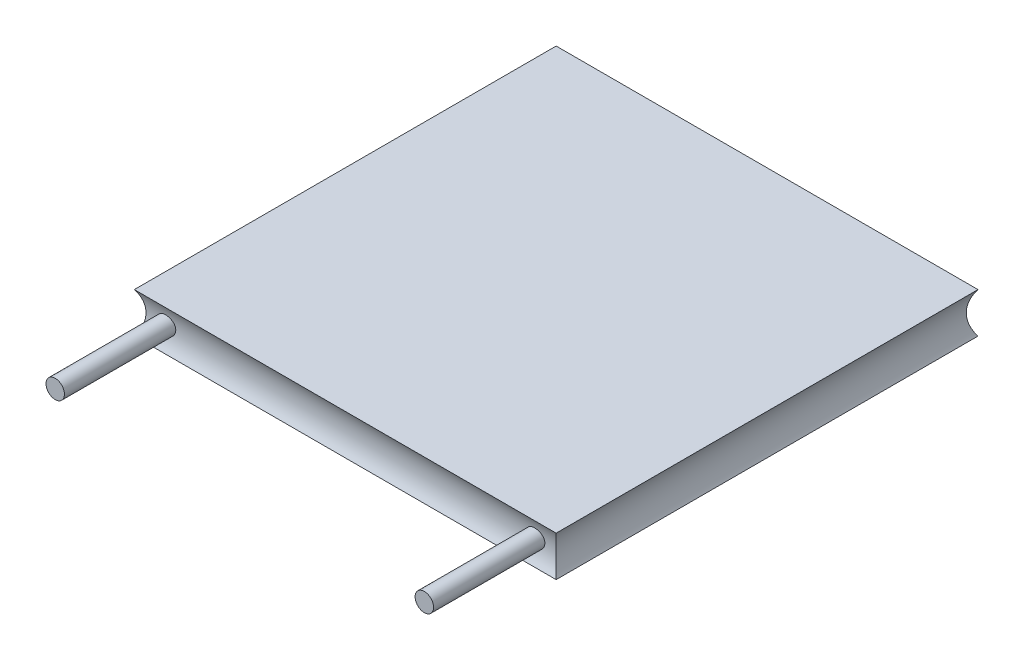
ISO-10303-21;
HEADER;
FILE_DESCRIPTION(('STEP AP214'),'2;1');
FILE_NAME('part.step','',(''),(''),'','','');
FILE_SCHEMA(('AUTOMOTIVE_DESIGN { 1 0 10303 214 1 1 1 1 }'));
ENDSEC;
DATA;
#1=APPLICATION_CONTEXT('core data for automotive mechanical design processes');
#2=APPLICATION_PROTOCOL_DEFINITION('international standard','automotive_design',2000,#1);
#3=PRODUCT_CONTEXT('',#1,'mechanical');
#4=PRODUCT('Part','Part','',(#3));
#5=PRODUCT_RELATED_PRODUCT_CATEGORY('part','',(#4));
#6=PRODUCT_DEFINITION_FORMATION('','',#4);
#7=PRODUCT_DEFINITION_CONTEXT('part definition',#1,'design');
#8=PRODUCT_DEFINITION('design','',#6,#7);
#9=PRODUCT_DEFINITION_SHAPE('','',#8);
#10=(LENGTH_UNIT() NAMED_UNIT(*) SI_UNIT(.MILLI.,.METRE.));
#11=(NAMED_UNIT(*) PLANE_ANGLE_UNIT() SI_UNIT($,.RADIAN.));
#12=(NAMED_UNIT(*) SI_UNIT($,.STERADIAN.) SOLID_ANGLE_UNIT());
#13=UNCERTAINTY_MEASURE_WITH_UNIT(LENGTH_MEASURE(1.E-05),#10,'distance_accuracy_value','');
#14=(GEOMETRIC_REPRESENTATION_CONTEXT(3) GLOBAL_UNCERTAINTY_ASSIGNED_CONTEXT((#13)) GLOBAL_UNIT_ASSIGNED_CONTEXT((#10,
#11,#12)) REPRESENTATION_CONTEXT('',''));
#15=CARTESIAN_POINT('',(0.,0.,0.));
#16=DIRECTION('',(0.,0.,1.));
#17=DIRECTION('',(1.,0.,0.));
#18=AXIS2_PLACEMENT_3D('',#15,#16,#17);
#19=CARTESIAN_POINT('',(43.,1.91,-40.));
#20=DIRECTION('',(0.,0.,1.));
#21=DIRECTION('',(1.,0.,0.));
#22=AXIS2_PLACEMENT_3D('',#19,#20,#21);
#23=CYLINDRICAL_SURFACE('',#22,3.55641673598582);
#24=CARTESIAN_POINT('',(43.,1.91,-43.));
#25=DIRECTION('',(0.707106781186547,0.,0.707106781186548));
#26=DIRECTION('',(-0.707106781186547,0.,0.707106781186548));
#27=AXIS2_PLACEMENT_3D('',#24,#25,#26);
#28=ELLIPSE('',#27,5.0295327814818,3.55641673598582);
#29=CARTESIAN_POINT('',(40.,3.82,-40.));
#30=VERTEX_POINT('',#29);
#31=CARTESIAN_POINT('',(40.,0.,-40.));
#32=VERTEX_POINT('',#31);
#33=EDGE_CURVE('E101',#30,#32,#28,.T.);
#34=ORIENTED_EDGE('',*,*,#33,.F.);
#35=DIRECTION('',(0.,0.,-1.));
#36=VECTOR('',#35,1.);
#37=CARTESIAN_POINT('',(40.,3.82,0.));
#38=LINE('',#37,#36);
#39=CARTESIAN_POINT('',(40.,3.82,0.));
#40=VERTEX_POINT('',#39);
#41=EDGE_CURVE('E92',#40,#30,#38,.T.);
#42=ORIENTED_EDGE('',*,*,#41,.F.);
#43=CARTESIAN_POINT('',(43.,1.91,3.));
#44=DIRECTION('',(-0.707106781186547,0.,0.707106781186548));
#45=DIRECTION('',(0.707106781186547,0.,0.707106781186548));
#46=AXIS2_PLACEMENT_3D('',#43,#44,#45);
#47=ELLIPSE('',#46,5.0295327814818,3.55641673598582);
#48=CARTESIAN_POINT('',(40.,0.,0.));
#49=VERTEX_POINT('',#48);
#50=EDGE_CURVE('E112',#40,#49,#47,.T.);
#51=ORIENTED_EDGE('',*,*,#50,.T.);
#52=DIRECTION('',(0.,0.,-1.));
#53=VECTOR('',#52,1.);
#54=CARTESIAN_POINT('',(40.,0.,0.));
#55=LINE('',#54,#53);
#56=EDGE_CURVE('E103',#49,#32,#55,.T.);
#57=ORIENTED_EDGE('',*,*,#56,.T.);
#58=EDGE_LOOP('',(#34,#42,#51,#57));
#59=FACE_BOUND('',#58,.T.);
#60=ADVANCED_FACE('F32',(#59),#23,.F.);
#61=CARTESIAN_POINT('',(-3.,1.91,-40.));
#62=DIRECTION('',(0.,0.,1.));
#63=DIRECTION('',(1.,0.,0.));
#64=AXIS2_PLACEMENT_3D('',#61,#62,#63);
#65=CYLINDRICAL_SURFACE('',#64,3.55641673598582);
#66=DIRECTION('',(0.,0.,1.));
#67=VECTOR('',#66,1.);
#68=CARTESIAN_POINT('',(0.,3.82,0.));
#69=LINE('',#68,#67);
#70=CARTESIAN_POINT('',(0.,3.82,-40.));
#71=VERTEX_POINT('',#70);
#72=CARTESIAN_POINT('',(0.,3.82,0.));
#73=VERTEX_POINT('',#72);
#74=EDGE_CURVE('E85',#71,#73,#69,.T.);
#75=ORIENTED_EDGE('',*,*,#74,.F.);
#76=CARTESIAN_POINT('',(-2.99999999999999,1.91,-43.));
#77=DIRECTION('',(-0.707106781186547,0.,0.707106781186548));
#78=DIRECTION('',(0.707106781186547,0.,0.707106781186548));
#79=AXIS2_PLACEMENT_3D('',#76,#77,#78);
#80=ELLIPSE('',#79,5.0295327814818,3.55641673598582);
#81=CARTESIAN_POINT('',(0.,0.,-40.));
#82=VERTEX_POINT('',#81);
#83=EDGE_CURVE('E11',#71,#82,#80,.F.);
#84=ORIENTED_EDGE('',*,*,#83,.T.);
#85=DIRECTION('',(0.,0.,1.));
#86=VECTOR('',#85,1.);
#87=CARTESIAN_POINT('',(0.,0.,0.));
#88=LINE('',#87,#86);
#89=CARTESIAN_POINT('',(0.,0.,0.));
#90=VERTEX_POINT('',#89);
#91=EDGE_CURVE('E98',#82,#90,#88,.T.);
#92=ORIENTED_EDGE('',*,*,#91,.T.);
#93=CARTESIAN_POINT('',(-2.99999999999999,1.91,3.));
#94=DIRECTION('',(0.707106781186547,0.,0.707106781186548));
#95=DIRECTION('',(-0.707106781186547,0.,0.707106781186548));
#96=AXIS2_PLACEMENT_3D('',#93,#94,#95);
#97=ELLIPSE('',#96,5.02953278148179,3.55641673598582);
#98=EDGE_CURVE('E46',#73,#90,#97,.F.);
#99=ORIENTED_EDGE('',*,*,#98,.F.);
#100=EDGE_LOOP('',(#75,#84,#92,#99));
#101=FACE_BOUND('',#100,.T.);
#102=ADVANCED_FACE('F86',(#101),#65,.F.);
#103=CARTESIAN_POINT('',(0.,3.82,0.));
#104=DIRECTION('',(0.,-1.,0.));
#105=DIRECTION('',(0.,0.,-1.));
#106=AXIS2_PLACEMENT_3D('',#103,#104,#105);
#107=PLANE('',#106);
#108=ORIENTED_EDGE('',*,*,#74,.T.);
#109=DIRECTION('',(1.,0.,0.));
#110=VECTOR('',#109,1.);
#111=CARTESIAN_POINT('',(0.,3.82,0.));
#112=LINE('',#111,#110);
#113=EDGE_CURVE('E61',#73,#40,#112,.T.);
#114=ORIENTED_EDGE('',*,*,#113,.T.);
#115=ORIENTED_EDGE('',*,*,#41,.T.);
#116=DIRECTION('',(-1.,0.,0.));
#117=VECTOR('',#116,1.);
#118=CARTESIAN_POINT('',(0.,3.82,-40.));
#119=LINE('',#118,#117);
#120=EDGE_CURVE('E79',#30,#71,#119,.T.);
#121=ORIENTED_EDGE('',*,*,#120,.T.);
#122=EDGE_LOOP('',(#108,#114,#115,#121));
#123=FACE_BOUND('',#122,.T.);
#124=ADVANCED_FACE('F90',(#123),#107,.F.);
#125=CARTESIAN_POINT('',(0.,0.,0.));
#126=DIRECTION('',(0.,-1.,0.));
#127=DIRECTION('',(0.,0.,-1.));
#128=AXIS2_PLACEMENT_3D('',#125,#126,#127);
#129=PLANE('',#128);
#130=ORIENTED_EDGE('',*,*,#91,.F.);
#131=DIRECTION('',(-1.,0.,0.));
#132=VECTOR('',#131,1.);
#133=CARTESIAN_POINT('',(0.,0.,-40.));
#134=LINE('',#133,#132);
#135=EDGE_CURVE('E54',#32,#82,#134,.T.);
#136=ORIENTED_EDGE('',*,*,#135,.F.);
#137=ORIENTED_EDGE('',*,*,#56,.F.);
#138=DIRECTION('',(1.,0.,0.));
#139=VECTOR('',#138,1.);
#140=CARTESIAN_POINT('',(0.,0.,0.));
#141=LINE('',#140,#139);
#142=EDGE_CURVE('E100',#90,#49,#141,.T.);
#143=ORIENTED_EDGE('',*,*,#142,.F.);
#144=EDGE_LOOP('',(#130,#136,#137,#143));
#145=FACE_BOUND('',#144,.T.);
#146=ADVANCED_FACE('F34',(#145),#129,.T.);
#147=CARTESIAN_POINT('',(45.,1.91,3.));
#148=DIRECTION('',(-1.,0.,0.));
#149=DIRECTION('',(0.,0.,1.));
#150=AXIS2_PLACEMENT_3D('',#147,#148,#149);
#151=CYLINDRICAL_SURFACE('',#150,3.55641673598582);
#152=CARTESIAN_POINT('',(38.375,1.91,-0.556416735985814));
#153=CARTESIAN_POINT('',(38.374998598679,1.8616308459115,-0.556415902527128));
#154=CARTESIAN_POINT('',(38.3709757996563,1.81324587995912,-0.555420108855625));
#155=CARTESIAN_POINT('',(38.3550139973309,1.71786101958329,-0.551544136294851));
#156=CARTESIAN_POINT('',(38.3430703514392,1.67086195435182,-0.548662852289799));
#157=CARTESIAN_POINT('',(38.3116720050362,1.57964025191008,-0.541335191646021));
#158=CARTESIAN_POINT('',(38.2922261698422,1.53541440903252,-0.536890662835052));
#159=CARTESIAN_POINT('',(38.2464062339312,1.45085282436528,-0.5269106986228));
#160=CARTESIAN_POINT('',(38.2200319531521,1.4105171837146,-0.521375234870345));
#161=CARTESIAN_POINT('',(38.1605466618434,1.33407432400642,-0.509691335434536));
#162=CARTESIAN_POINT('',(38.1273232547772,1.29805597204518,-0.503533682584858));
#163=CARTESIAN_POINT('',(38.0553235301818,1.23204225568536,-0.491361128569465));
#164=CARTESIAN_POINT('',(38.0165466054352,1.20204755077042,-0.485346243097772));
#165=CARTESIAN_POINT('',(37.9338549707972,1.14851809653142,-0.474047617559852));
#166=CARTESIAN_POINT('',(37.8898745795205,1.12508211360706,-0.468775594383573));
#167=CARTESIAN_POINT('',(37.7984477655658,1.08597029571158,-0.459693764252192));
#168=CARTESIAN_POINT('',(37.7510018791969,1.07029326289749,-0.455883731612347));
#169=CARTESIAN_POINT('',(37.6549663807905,1.04744626522004,-0.450251894432766));
#170=CARTESIAN_POINT('',(37.6064169391631,1.04011683182947,-0.448392874946176));
#171=CARTESIAN_POINT('',(37.5087446926879,1.03367647971918,-0.446762106119825));
#172=CARTESIAN_POINT('',(37.4596219792193,1.03456426857747,-0.446990028541391));
#173=CARTESIAN_POINT('',(37.3634147829779,1.04440578109864,-0.44947390609781));
#174=CARTESIAN_POINT('',(37.3163095078391,1.05317013321315,-0.451682244618913));
#175=CARTESIAN_POINT('',(37.2242592826337,1.07821417226658,-0.457802326656352));
#176=CARTESIAN_POINT('',(37.1793144823828,1.09449437955591,-0.461714188112809));
#177=CARTESIAN_POINT('',(37.0923499646283,1.13427102196733,-0.470844679217189));
#178=CARTESIAN_POINT('',(37.0503632921939,1.15783672627569,-0.476075759777016));
#179=CARTESIAN_POINT('',(36.9708721025532,1.21146694168881,-0.487248170095442));
#180=CARTESIAN_POINT('',(36.9333683485551,1.24153255695092,-0.493189620449726));
#181=CARTESIAN_POINT('',(36.8628216672831,1.30829294959149,-0.505314324464301));
#182=CARTESIAN_POINT('',(36.8299303148508,1.34514770318591,-0.511499727423643));
#183=CARTESIAN_POINT('',(36.7707666845995,1.42392360624861,-0.523267424917355));
#184=CARTESIAN_POINT('',(36.7444945966379,1.4658449009872,-0.528849702149916));
#185=CARTESIAN_POINT('',(36.6992620859443,1.55377596469481,-0.538808555390594));
#186=CARTESIAN_POINT('',(36.6803256444725,1.59979854824151,-0.543181163725099));
#187=CARTESIAN_POINT('',(36.6504998890942,1.6945051506441,-0.55019908835339));
#188=CARTESIAN_POINT('',(36.6396090857058,1.74318867508915,-0.552844724349472));
#189=CARTESIAN_POINT('',(36.6264137616661,1.8405387173423,-0.556063542336874));
#190=CARTESIAN_POINT('',(36.6239027451586,1.88917563876097,-0.556686555374659));
#191=CARTESIAN_POINT('',(36.6269728024684,1.98617461128272,-0.555931552601305));
#192=CARTESIAN_POINT('',(36.6325531722607,2.03453668593246,-0.554553710882928));
#193=CARTESIAN_POINT('',(36.6514772258248,2.12890004023056,-0.549983685565589));
#194=CARTESIAN_POINT('',(36.6647088365018,2.17492517938725,-0.54681770929121));
#195=CARTESIAN_POINT('',(36.6984322475748,2.26410057895302,-0.539027837376695));
#196=CARTESIAN_POINT('',(36.7189247675669,2.30725055391378,-0.534403797239417));
#197=CARTESIAN_POINT('',(36.7669924644276,2.39027668411087,-0.524090838643032));
#198=CARTESIAN_POINT('',(36.7946840572096,2.43008327358292,-0.518384878998332));
#199=CARTESIAN_POINT('',(36.8562144499483,2.50455799707723,-0.506568846043651));
#200=CARTESIAN_POINT('',(36.8900542755864,2.53922527197625,-0.500458705414328));
#201=CARTESIAN_POINT('',(36.9638779977032,2.60328372723844,-0.488344528011203));
#202=CARTESIAN_POINT('',(37.0039885765891,2.63253027693132,-0.482346444479975));
#203=CARTESIAN_POINT('',(37.0886707452974,2.68387638366637,-0.471297715768934));
#204=CARTESIAN_POINT('',(37.1332421358646,2.70597625974918,-0.466247028299848));
#205=CARTESIAN_POINT('',(37.2253396874762,2.74223835079458,-0.45771983805811));
#206=CARTESIAN_POINT('',(37.2728464308914,2.75644758170368,-0.454234035393266));
#207=CARTESIAN_POINT('',(37.3696729339036,2.77665124671594,-0.449221071542242));
#208=CARTESIAN_POINT('',(37.4189923095747,2.78264741021523,-0.447693498023127));
#209=CARTESIAN_POINT('',(37.516574250706,2.78616652903147,-0.446800670529186));
#210=CARTESIAN_POINT('',(37.5648280858243,2.78392037493124,-0.447376492432506));
#211=CARTESIAN_POINT('',(37.6602463612992,2.77154541074651,-0.450489736677328));
#212=CARTESIAN_POINT('',(37.7074108222128,2.76141674953446,-0.453027121971889));
#213=CARTESIAN_POINT('',(37.799069522786,2.73368853807055,-0.4597452817604));
#214=CARTESIAN_POINT('',(37.8435771970966,2.7161310025936,-0.463916804526822));
#215=CARTESIAN_POINT('',(37.929046319961,2.67407691392435,-0.473434786722396));
#216=CARTESIAN_POINT('',(37.970007291187,2.64957942861861,-0.478781403958331));
#217=CARTESIAN_POINT('',(38.0483390704684,2.59361139904167,-0.490216247316178));
#218=CARTESIAN_POINT('',(38.0855927647285,2.56198005222503,-0.496319819146108));
#219=CARTESIAN_POINT('',(38.1543386073036,2.49295727121688,-0.508487801772201));
#220=CARTESIAN_POINT('',(38.1858293918904,2.45556447748931,-0.514552202972385));
#221=CARTESIAN_POINT('',(38.2426882703491,2.37529555496477,-0.526084303366374));
#222=CARTESIAN_POINT('',(38.2679403830674,2.33233538806343,-0.531539793713082));
#223=CARTESIAN_POINT('',(38.3108240229416,2.24265001238727,-0.541111551898993));
#224=CARTESIAN_POINT('',(38.3284611383486,2.19592759451138,-0.545228801253424));
#225=CARTESIAN_POINT('',(38.3529246148235,2.10939136916296,-0.551034340816316));
#226=CARTESIAN_POINT('',(38.3611852834943,2.06999803572006,-0.553039062397555));
#227=CARTESIAN_POINT('',(38.3722233654528,1.99040673917247,-0.555730559996669));
#228=CARTESIAN_POINT('',(38.3750011649052,1.95020883293622,-0.556417428832355));
#229=CARTESIAN_POINT('',(38.375,1.91,-0.556416735985814));
#230=B_SPLINE_CURVE_WITH_KNOTS('',3,(#152,#153,#154,#155,#156,#157,#158,#159,#160,#161,#162,
#163,#164,#165,#166,#167,#168,#169,#170,#171,#172,#173,#174,#175,#176,#177,#178,#179,#180,#181,
#182,#183,#184,#185,#186,#187,#188,#189,#190,#191,#192,#193,#194,#195,#196,#197,#198,#199,#200,
#201,#202,#203,#204,#205,#206,#207,#208,#209,#210,#211,#212,#213,#214,#215,#216,#217,#218,#219,
#220,#221,#222,#223,#224,#225,#226,#227,#228,#229),.UNSPECIFIED.,.T.,.F.,(4,2,2,2,2,2,2,2,2,2,2,
2,2,2,2,2,2,2,2,2,2,2,2,2,2,2,2,2,2,2,2,2,2,2,2,2,2,2,4),(0.,0.144960135121688,
0.290005309867597,0.43487960752676,0.579757670669876,0.727235546809821,0.874729560396967,
1.02433788571062,1.17392310696737,1.32060009433878,1.4672540124372,1.6104736501978,
1.75370320507036,1.89833877092233,2.04299892573905,2.19164920131279,2.34030374007066,
2.48944023089122,2.63854910528175,2.78395536629735,2.92934897638913,3.07266498879996,
3.21599520858988,3.36180547196139,3.50764008256232,3.65693339635088,3.80622004449124,
3.95460736166616,4.10296342865066,4.24719575340382,4.39142535418905,4.53484992855497,
4.67829377559708,4.82536837197727,4.97247772704175,5.12214499518537,5.27170224283497,
5.39221475808379,5.5127187851928),.UNSPECIFIED.);
#231=CARTESIAN_POINT('',(38.375,1.91,-0.556416735985814));
#232=VERTEX_POINT('',#231);
#233=EDGE_CURVE('E36',#232,#232,#230,.T.);
#234=ORIENTED_EDGE('',*,*,#233,.T.);
#235=EDGE_LOOP('',(#234));
#236=FACE_BOUND('',#235,.T.);
#237=CARTESIAN_POINT('',(3.375,1.91,-0.556416735985814));
#238=CARTESIAN_POINT('',(3.37499859867904,1.8616308459115,-0.556415902527128));
#239=CARTESIAN_POINT('',(3.37097579965628,1.81324587995912,-0.555420108855626));
#240=CARTESIAN_POINT('',(3.35501399733093,1.71786101958329,-0.551544136294851));
#241=CARTESIAN_POINT('',(3.34307035143919,1.67086195435182,-0.548662852289799));
#242=CARTESIAN_POINT('',(3.31167200503617,1.57964025191008,-0.541335191646021));
#243=CARTESIAN_POINT('',(3.29222616984221,1.53541440903252,-0.536890662835052));
#244=CARTESIAN_POINT('',(3.24640623393124,1.45085282436528,-0.5269106986228));
#245=CARTESIAN_POINT('',(3.22003195315212,1.4105171837146,-0.521375234870345));
#246=CARTESIAN_POINT('',(3.16054666184342,1.33407432400642,-0.509691335434536));
#247=CARTESIAN_POINT('',(3.12732325477717,1.29805597204518,-0.503533682584858));
#248=CARTESIAN_POINT('',(3.05532353018179,1.23204225568536,-0.491361128569464));
#249=CARTESIAN_POINT('',(3.01654660543525,1.20204755077042,-0.485346243097772));
#250=CARTESIAN_POINT('',(2.93385497079722,1.14851809653142,-0.474047617559852));
#251=CARTESIAN_POINT('',(2.88987457952052,1.12508211360705,-0.468775594383572));
#252=CARTESIAN_POINT('',(2.7984477655658,1.08597029571158,-0.459693764252191));
#253=CARTESIAN_POINT('',(2.75100187919687,1.07029326289749,-0.455883731612346));
#254=CARTESIAN_POINT('',(2.6549663807905,1.04744626522004,-0.450251894432765));
#255=CARTESIAN_POINT('',(2.60641693916312,1.04011683182946,-0.448392874946176));
#256=CARTESIAN_POINT('',(2.50874469268794,1.03367647971917,-0.446762106119824));
#257=CARTESIAN_POINT('',(2.45962197921934,1.03456426857746,-0.44699002854139));
#258=CARTESIAN_POINT('',(2.36341478297788,1.04440578109864,-0.449473906097809));
#259=CARTESIAN_POINT('',(2.31630950783909,1.05317013321315,-0.451682244618913));
#260=CARTESIAN_POINT('',(2.22425928263374,1.07821417226658,-0.457802326656351));
#261=CARTESIAN_POINT('',(2.17931448238275,1.09449437955591,-0.461714188112809));
#262=CARTESIAN_POINT('',(2.09234996462831,1.13427102196734,-0.47084467921719));
#263=CARTESIAN_POINT('',(2.05036329219392,1.15783672627569,-0.476075759777017));
#264=CARTESIAN_POINT('',(1.97087210255316,1.21146694168882,-0.487248170095443));
#265=CARTESIAN_POINT('',(1.93336834855515,1.24153255695092,-0.493189620449726));
#266=CARTESIAN_POINT('',(1.86282166728311,1.30829294959148,-0.5053143244643));
#267=CARTESIAN_POINT('',(1.8299303148508,1.34514770318591,-0.511499727423642));
#268=CARTESIAN_POINT('',(1.77076668459947,1.4239236062486,-0.523267424917354));
#269=CARTESIAN_POINT('',(1.74449459663786,1.46584490098719,-0.528849702149916));
#270=CARTESIAN_POINT('',(1.69926208594429,1.55377596469481,-0.538808555390594));
#271=CARTESIAN_POINT('',(1.68032564447252,1.59979854824151,-0.543181163725099));
#272=CARTESIAN_POINT('',(1.6504998890942,1.6945051506441,-0.550199088353389));
#273=CARTESIAN_POINT('',(1.6396090857058,1.74318867508915,-0.552844724349472));
#274=CARTESIAN_POINT('',(1.6264137616661,1.8405387173423,-0.556063542336874));
#275=CARTESIAN_POINT('',(1.62390274515859,1.88917563876097,-0.556686555374659));
#276=CARTESIAN_POINT('',(1.62697280246843,1.98617461128273,-0.555931552601305));
#277=CARTESIAN_POINT('',(1.63255317226071,2.03453668593246,-0.554553710882929));
#278=CARTESIAN_POINT('',(1.65147722582484,2.12890004023056,-0.549983685565589));
#279=CARTESIAN_POINT('',(1.66470883650181,2.17492517938725,-0.54681770929121));
#280=CARTESIAN_POINT('',(1.69843224757483,2.26410057895302,-0.539027837376695));
#281=CARTESIAN_POINT('',(1.7189247675669,2.30725055391378,-0.534403797239417));
#282=CARTESIAN_POINT('',(1.7669924644276,2.39027668411087,-0.524090838643032));
#283=CARTESIAN_POINT('',(1.79468405720963,2.43008327358292,-0.518384878998332));
#284=CARTESIAN_POINT('',(1.85621444994828,2.50455799707723,-0.50656884604365));
#285=CARTESIAN_POINT('',(1.89005427558637,2.53922527197625,-0.500458705414327));
#286=CARTESIAN_POINT('',(1.96387799770317,2.60328372723844,-0.488344528011202));
#287=CARTESIAN_POINT('',(2.00398857658905,2.63253027693132,-0.482346444479974));
#288=CARTESIAN_POINT('',(2.08867074529738,2.68387638366637,-0.471297715768933));
#289=CARTESIAN_POINT('',(2.13324213586464,2.70597625974918,-0.466247028299848));
#290=CARTESIAN_POINT('',(2.22533968747624,2.74223835079458,-0.45771983805811));
#291=CARTESIAN_POINT('',(2.27284643089141,2.75644758170368,-0.454234035393265));
#292=CARTESIAN_POINT('',(2.36967293390364,2.77665124671595,-0.449221071542242));
#293=CARTESIAN_POINT('',(2.41899230957466,2.78264741021523,-0.447693498023127));
#294=CARTESIAN_POINT('',(2.51657425070601,2.78616652903147,-0.446800670529185));
#295=CARTESIAN_POINT('',(2.56482808582434,2.78392037493124,-0.447376492432505));
#296=CARTESIAN_POINT('',(2.66024636129921,2.77154541074651,-0.450489736677327));
#297=CARTESIAN_POINT('',(2.70741082221282,2.76141674953446,-0.453027121971889));
#298=CARTESIAN_POINT('',(2.79906952278598,2.73368853807055,-0.459745281760399));
#299=CARTESIAN_POINT('',(2.84357719709662,2.71613100259361,-0.463916804526821));
#300=CARTESIAN_POINT('',(2.92904631996101,2.67407691392435,-0.473434786722396));
#301=CARTESIAN_POINT('',(2.97000729118703,2.64957942861861,-0.478781403958331));
#302=CARTESIAN_POINT('',(3.04833907046838,2.59361139904167,-0.490216247316178));
#303=CARTESIAN_POINT('',(3.0855927647285,2.56198005222503,-0.496319819146109));
#304=CARTESIAN_POINT('',(3.15433860730363,2.49295727121688,-0.508487801772201));
#305=CARTESIAN_POINT('',(3.18582939189037,2.45556447748931,-0.514552202972385));
#306=CARTESIAN_POINT('',(3.24268827034906,2.37529555496477,-0.526084303366373));
#307=CARTESIAN_POINT('',(3.26794038306745,2.33233538806343,-0.531539793713081));
#308=CARTESIAN_POINT('',(3.31082402294163,2.24265001238727,-0.541111551898992));
#309=CARTESIAN_POINT('',(3.32846113834865,2.19592759451138,-0.545228801253424));
#310=CARTESIAN_POINT('',(3.35292461482352,2.10939136916296,-0.551034340816316));
#311=CARTESIAN_POINT('',(3.36118528349434,2.06999803572007,-0.553039062397554));
#312=CARTESIAN_POINT('',(3.37222336545276,1.99040673917247,-0.555730559996669));
#313=CARTESIAN_POINT('',(3.37500116490523,1.95020883293622,-0.556417428832355));
#314=CARTESIAN_POINT('',(3.375,1.91,-0.556416735985814));
#315=B_SPLINE_CURVE_WITH_KNOTS('',3,(#237,#238,#239,#240,#241,#242,#243,#244,#245,#246,#247,
#248,#249,#250,#251,#252,#253,#254,#255,#256,#257,#258,#259,#260,#261,#262,#263,#264,#265,#266,
#267,#268,#269,#270,#271,#272,#273,#274,#275,#276,#277,#278,#279,#280,#281,#282,#283,#284,#285,
#286,#287,#288,#289,#290,#291,#292,#293,#294,#295,#296,#297,#298,#299,#300,#301,#302,#303,#304,
#305,#306,#307,#308,#309,#310,#311,#312,#313,#314),.UNSPECIFIED.,.T.,.F.,(4,2,2,2,2,2,2,2,2,2,2,
2,2,2,2,2,2,2,2,2,2,2,2,2,2,2,2,2,2,2,2,2,2,2,2,2,2,2,4),(0.,0.144960135121688,
0.290005309867597,0.434879607526761,0.579757670669879,0.727235546809819,0.874729560396968,
1.02433788571063,1.17392310696738,1.32060009433878,1.4672540124372,1.6104736501978,
1.75370320507036,1.89833877092234,2.04299892573906,2.19164920131278,2.34030374007066,
2.48944023089122,2.63854910528176,2.78395536629735,2.92934897638914,3.07266498879997,
3.21599520858989,3.36180547196139,3.50764008256232,3.65693339635089,3.80622004449124,
3.95460736166616,4.10296342865067,4.24719575340383,4.39142535418905,4.53484992855498,
4.67829377559708,4.82536837197728,4.97247772704175,5.12214499518538,5.27170224283498,
5.3922147580838,5.51271878519281),.UNSPECIFIED.);
#316=CARTESIAN_POINT('',(3.375,1.91,-0.556416735985814));
#317=VERTEX_POINT('',#316);
#318=EDGE_CURVE('E106',#317,#317,#315,.T.);
#319=ORIENTED_EDGE('',*,*,#318,.T.);
#320=EDGE_LOOP('',(#319));
#321=FACE_BOUND('',#320,.T.);
#322=ORIENTED_EDGE('',*,*,#113,.F.);
#323=ORIENTED_EDGE('',*,*,#98,.T.);
#324=ORIENTED_EDGE('',*,*,#142,.T.);
#325=ORIENTED_EDGE('',*,*,#50,.F.);
#326=EDGE_LOOP('',(#322,#323,#324,#325));
#327=FACE_BOUND('',#326,.T.);
#328=ADVANCED_FACE('F114',(#236,#321,#327),#151,.F.);
#329=CARTESIAN_POINT('',(45.,1.91,-43.));
#330=DIRECTION('',(-1.,0.,0.));
#331=DIRECTION('',(0.,0.,1.));
#332=AXIS2_PLACEMENT_3D('',#329,#330,#331);
#333=CYLINDRICAL_SURFACE('',#332,3.55641673598582);
#334=ORIENTED_EDGE('',*,*,#33,.T.);
#335=ORIENTED_EDGE('',*,*,#135,.T.);
#336=ORIENTED_EDGE('',*,*,#83,.F.);
#337=ORIENTED_EDGE('',*,*,#120,.F.);
#338=EDGE_LOOP('',(#334,#335,#336,#337));
#339=FACE_BOUND('',#338,.T.);
#340=ADVANCED_FACE('F77',(#339),#333,.F.);
#341=CARTESIAN_POINT('',(2.5,1.91,-5.));
#342=DIRECTION('',(0.,0.,1.));
#343=DIRECTION('',(1.,0.,0.));
#344=AXIS2_PLACEMENT_3D('',#341,#342,#343);
#345=CYLINDRICAL_SURFACE('',#344,0.875);
#346=CARTESIAN_POINT('',(2.5,1.91,10.));
#347=DIRECTION('',(0.,0.,1.));
#348=DIRECTION('',(1.,0.,0.));
#349=AXIS2_PLACEMENT_3D('',#346,#347,#348);
#350=CIRCLE('',#349,0.875);
#351=CARTESIAN_POINT('',(3.375,1.91,10.));
#352=VERTEX_POINT('',#351);
#353=EDGE_CURVE('E113',#352,#352,#350,.T.);
#354=ORIENTED_EDGE('',*,*,#353,.F.);
#355=EDGE_LOOP('',(#354));
#356=FACE_BOUND('',#355,.T.);
#357=ORIENTED_EDGE('',*,*,#318,.F.);
#358=EDGE_LOOP('',(#357));
#359=FACE_BOUND('',#358,.T.);
#360=ADVANCED_FACE('F118',(#356,#359),#345,.T.);
#361=CARTESIAN_POINT('',(2.5,1.91,10.));
#362=DIRECTION('',(0.,0.,1.));
#363=DIRECTION('',(1.,0.,0.));
#364=AXIS2_PLACEMENT_3D('',#361,#362,#363);
#365=PLANE('',#364);
#366=ORIENTED_EDGE('',*,*,#353,.T.);
#367=EDGE_LOOP('',(#366));
#368=FACE_BOUND('',#367,.T.);
#369=ADVANCED_FACE('F122',(#368),#365,.T.);
#370=CARTESIAN_POINT('',(37.5,1.91,-5.));
#371=DIRECTION('',(0.,0.,1.));
#372=DIRECTION('',(1.,0.,0.));
#373=AXIS2_PLACEMENT_3D('',#370,#371,#372);
#374=CYLINDRICAL_SURFACE('',#373,0.874999999999998);
#375=CARTESIAN_POINT('',(37.5,1.91,10.));
#376=DIRECTION('',(0.,0.,1.));
#377=DIRECTION('',(1.,0.,0.));
#378=AXIS2_PLACEMENT_3D('',#375,#376,#377);
#379=CIRCLE('',#378,0.874999999999998);
#380=CARTESIAN_POINT('',(38.375,1.91,10.));
#381=VERTEX_POINT('',#380);
#382=EDGE_CURVE('E150',#381,#381,#379,.T.);
#383=ORIENTED_EDGE('',*,*,#382,.F.);
#384=EDGE_LOOP('',(#383));
#385=FACE_BOUND('',#384,.T.);
#386=ORIENTED_EDGE('',*,*,#233,.F.);
#387=EDGE_LOOP('',(#386));
#388=FACE_BOUND('',#387,.T.);
#389=ADVANCED_FACE('F158',(#385,#388),#374,.T.);
#390=CARTESIAN_POINT('',(37.5,1.91,10.));
#391=DIRECTION('',(0.,0.,1.));
#392=DIRECTION('',(1.,0.,0.));
#393=AXIS2_PLACEMENT_3D('',#390,#391,#392);
#394=PLANE('',#393);
#395=ORIENTED_EDGE('',*,*,#382,.T.);
#396=EDGE_LOOP('',(#395));
#397=FACE_BOUND('',#396,.T.);
#398=ADVANCED_FACE('F160',(#397),#394,.T.);
#399=CLOSED_SHELL('',(#60,#102,#124,#146,#328,#340,#360,#369,#389,#398));
#400=MANIFOLD_SOLID_BREP('B2',#399);
#401=ADVANCED_BREP_SHAPE_REPRESENTATION('',(#18,#400),#14);
#402=SHAPE_DEFINITION_REPRESENTATION(#9,#401);
ENDSEC;
END-ISO-10303-21;
